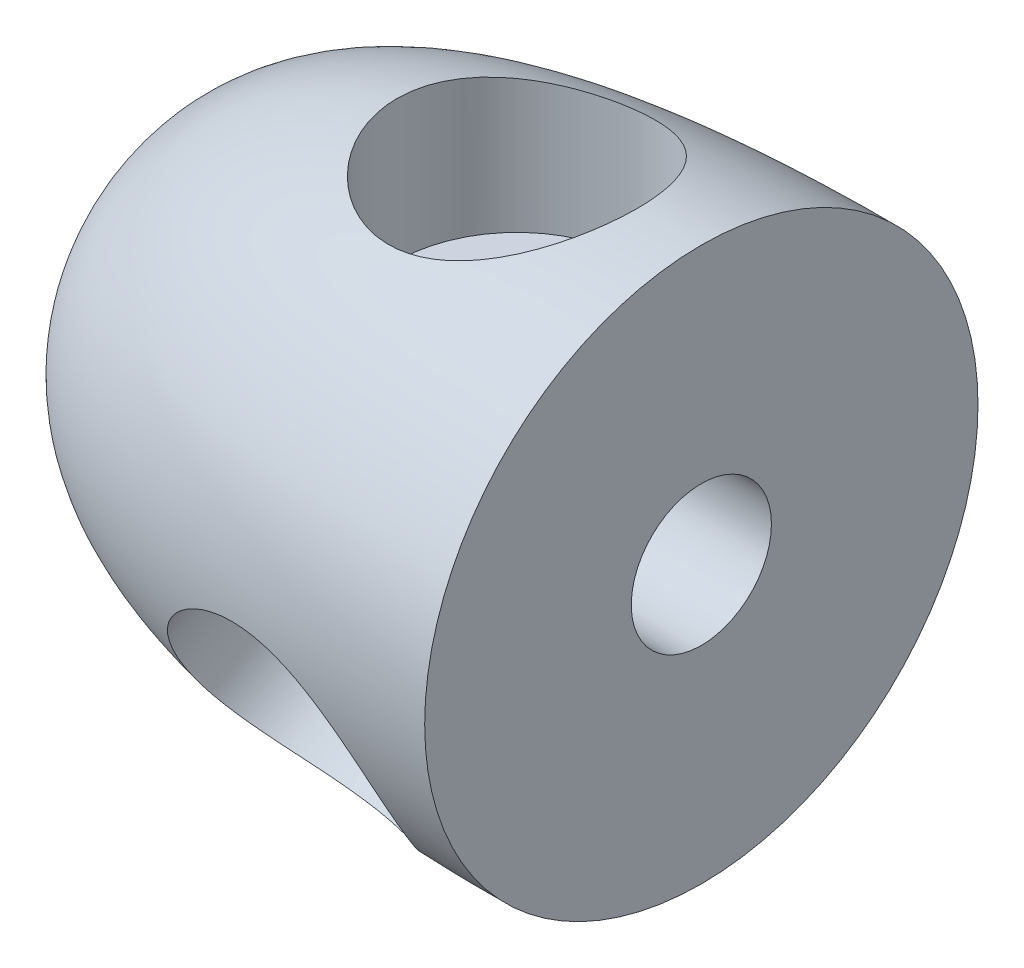
ISO-10303-21;
HEADER;
FILE_DESCRIPTION(('STEP AP214'),'2;1');
FILE_NAME('part.step','',(''),(''),'','','');
FILE_SCHEMA(('AUTOMOTIVE_DESIGN { 1 0 10303 214 1 1 1 1 }'));
ENDSEC;
DATA;
#1=APPLICATION_CONTEXT('core data for automotive mechanical design processes');
#2=APPLICATION_PROTOCOL_DEFINITION('international standard','automotive_design',2000,#1);
#3=PRODUCT_CONTEXT('',#1,'mechanical');
#4=PRODUCT('Part','Part','',(#3));
#5=PRODUCT_RELATED_PRODUCT_CATEGORY('part','',(#4));
#6=PRODUCT_DEFINITION_FORMATION('','',#4);
#7=PRODUCT_DEFINITION_CONTEXT('part definition',#1,'design');
#8=PRODUCT_DEFINITION('design','',#6,#7);
#9=PRODUCT_DEFINITION_SHAPE('','',#8);
#10=(LENGTH_UNIT() NAMED_UNIT(*) SI_UNIT(.MILLI.,.METRE.));
#11=(NAMED_UNIT(*) PLANE_ANGLE_UNIT() SI_UNIT($,.RADIAN.));
#12=(NAMED_UNIT(*) SI_UNIT($,.STERADIAN.) SOLID_ANGLE_UNIT());
#13=UNCERTAINTY_MEASURE_WITH_UNIT(LENGTH_MEASURE(1.E-05),#10,'distance_accuracy_value','');
#14=(GEOMETRIC_REPRESENTATION_CONTEXT(3) GLOBAL_UNCERTAINTY_ASSIGNED_CONTEXT((#13)) GLOBAL_UNIT_ASSIGNED_CONTEXT((#10,
#11,#12)) REPRESENTATION_CONTEXT('',''));
#15=CARTESIAN_POINT('',(0.,0.,0.));
#16=DIRECTION('',(0.,0.,1.));
#17=DIRECTION('',(1.,0.,0.));
#18=AXIS2_PLACEMENT_3D('',#15,#16,#17);
#19=CARTESIAN_POINT('',(0.,0.,0.));
#20=DIRECTION('',(-1.,0.,0.));
#21=DIRECTION('',(0.,0.,1.));
#22=AXIS2_PLACEMENT_3D('',#19,#20,#21);
#23=PLANE('',#22);
#24=CARTESIAN_POINT('',(0.,0.,0.));
#25=DIRECTION('',(1.,0.,0.));
#26=DIRECTION('',(0.,0.,-1.));
#27=AXIS2_PLACEMENT_3D('',#24,#25,#26);
#28=CIRCLE('',#27,4.826);
#29=CARTESIAN_POINT('',(0.,0.,-4.826));
#30=VERTEX_POINT('',#29);
#31=EDGE_CURVE('E60',#30,#30,#28,.T.);
#32=ORIENTED_EDGE('',*,*,#31,.F.);
#33=EDGE_LOOP('',(#32));
#34=FACE_BOUND('',#33,.T.);
#35=CARTESIAN_POINT('',(0.,0.,0.));
#36=DIRECTION('',(-1.,0.,0.));
#37=DIRECTION('',(0.,0.,1.));
#38=AXIS2_PLACEMENT_3D('',#35,#36,#37);
#39=CIRCLE('',#38,19.05);
#40=CARTESIAN_POINT('',(0.,0.,19.05));
#41=VERTEX_POINT('',#40);
#42=EDGE_CURVE('E11',#41,#41,#39,.T.);
#43=ORIENTED_EDGE('',*,*,#42,.F.);
#44=EDGE_LOOP('',(#43));
#45=FACE_BOUND('',#44,.T.);
#46=ADVANCED_FACE('F33',(#34,#45),#23,.F.);
#47=CARTESIAN_POINT('',(0.,19.05,0.));
#48=CARTESIAN_POINT('',(-25.4441957214029,19.05,0.));
#49=CARTESIAN_POINT('',(-38.1,14.1990316571237,0.));
#50=CARTESIAN_POINT('',(-38.1,0.,0.));
#51=B_SPLINE_CURVE_WITH_KNOTS('',3,(#47,#48,#49,#50),.UNSPECIFIED.,.F.,.F.,(4,4),(0.,1.),.UNSPECIFIED.);
#52=CARTESIAN_POINT('',(-38.1,0.,0.));
#53=DIRECTION('',(-1.,0.,0.));
#54=AXIS1_PLACEMENT('',#52,#53);
#55=SURFACE_OF_REVOLUTION('',#51,#54);
#56=CARTESIAN_POINT('',(-12.7,-1.14782703609506,-18.4980947448177));
#57=CARTESIAN_POINT('',(-12.9184952872142,-1.13648898272611,-18.4784599625496));
#58=CARTESIAN_POINT('',(-13.1373260376817,-1.13438877234002,-18.4574578105463));
#59=CARTESIAN_POINT('',(-13.5740864940327,-1.14879291758203,-18.4127967094672));
#60=CARTESIAN_POINT('',(-13.7920163205555,-1.16529469558681,-18.3891381288941));
#61=CARTESIAN_POINT('',(-14.2253045854663,-1.2167632959589,-18.3391447495213));
#62=CARTESIAN_POINT('',(-14.4406637530974,-1.25172474795742,-18.3128107308703));
#63=CARTESIAN_POINT('',(-14.8672966698883,-1.33970911927939,-18.2573268266777));
#64=CARTESIAN_POINT('',(-15.0785702602157,-1.39273273930844,-18.2281768319242));
#65=CARTESIAN_POINT('',(-15.4952440277729,-1.51611964245539,-18.1668726200219));
#66=CARTESIAN_POINT('',(-15.7006512322329,-1.58646111721522,-18.1347222126675));
#67=CARTESIAN_POINT('',(-16.1044609920185,-1.74367454707584,-18.0670808439223));
#68=CARTESIAN_POINT('',(-16.3028635923958,-1.83054639583457,-18.0315899040224));
#69=CARTESIAN_POINT('',(-16.6914018793307,-2.01983712317306,-17.9568991653748));
#70=CARTESIAN_POINT('',(-16.881536620275,-2.12225777411842,-17.9176989440085));
#71=CARTESIAN_POINT('',(-17.2524140665755,-2.34157526012525,-17.8351789583641));
#72=CARTESIAN_POINT('',(-17.4331533315445,-2.45847734564972,-17.7918577012712));
#73=CARTESIAN_POINT('',(-17.7887696530738,-2.70883932726889,-17.6994830743713));
#74=CARTESIAN_POINT('',(-17.9633635967759,-2.84265647396016,-17.650308039215));
#75=CARTESIAN_POINT('',(-18.3004148882535,-3.12296526081468,-17.5467570043083));
#76=CARTESIAN_POINT('',(-18.462871858884,-3.2694572945332,-17.4923808430573));
#77=CARTESIAN_POINT('',(-18.7747269887289,-3.57381086873153,-17.3780096484907));
#78=CARTESIAN_POINT('',(-18.9241211735587,-3.73167584299441,-17.3180129165242));
#79=CARTESIAN_POINT('',(-19.2088481047253,-4.05730697036979,-17.1920916547786));
#80=CARTESIAN_POINT('',(-19.3441852810386,-4.22506997788634,-17.1261690048069));
#81=CARTESIAN_POINT('',(-19.605432120648,-4.57643882767141,-16.9851877577304));
#82=CARTESIAN_POINT('',(-19.7306999673487,-4.76041471404987,-16.9098605157383));
#83=CARTESIAN_POINT('',(-19.9642156569031,-5.13604803893372,-16.7522706384485));
#84=CARTESIAN_POINT('',(-20.0724629971505,-5.32770570406825,-16.6700077984563));
#85=CARTESIAN_POINT('',(-20.2711162752368,-5.71704029151394,-16.4985061194298));
#86=CARTESIAN_POINT('',(-20.3615233280152,-5.91471683677977,-16.4092677168244));
#87=CARTESIAN_POINT('',(-20.5237825863659,-6.31441783695025,-16.2239222958931));
#88=CARTESIAN_POINT('',(-20.5956352159103,-6.51644219239229,-16.127815434577));
#89=CARTESIAN_POINT('',(-20.7194274905695,-6.92066874267272,-15.9302219032014));
#90=CARTESIAN_POINT('',(-20.7715984529644,-7.12283895857853,-15.8288147775326));
#91=CARTESIAN_POINT('',(-20.8568002834004,-7.5281222767446,-15.6200131567239));
#92=CARTESIAN_POINT('',(-20.8898312424468,-7.73123537451709,-15.5126186900547));
#93=CARTESIAN_POINT('',(-20.9364569808445,-8.13674806856399,-15.2924715863117));
#94=CARTESIAN_POINT('',(-20.9500547574998,-8.33914777006531,-15.1797197783073));
#95=CARTESIAN_POINT('',(-20.9577006911394,-8.74168750603885,-14.949617970229));
#96=CARTESIAN_POINT('',(-20.9517492252,-8.94182758402121,-14.832268058889));
#97=CARTESIAN_POINT('',(-20.9207890475571,-9.33283812464561,-14.597208815607));
#98=CARTESIAN_POINT('',(-20.8963144933303,-9.52381162868479,-14.4796000853769));
#99=CARTESIAN_POINT('',(-20.8291480270427,-9.90092904838058,-14.2418787475666));
#100=CARTESIAN_POINT('',(-20.7864564921679,-10.087073063948,-14.1217661918775));
#101=CARTESIAN_POINT('',(-20.6832063858706,-10.453374165127,-13.8801000130434));
#102=CARTESIAN_POINT('',(-20.6226474919351,-10.6335311426048,-13.758546363924));
#103=CARTESIAN_POINT('',(-20.4841418428173,-10.9868242030264,-13.5151452195354));
#104=CARTESIAN_POINT('',(-20.4061948385932,-11.1599601853698,-13.3932977200822));
#105=CARTESIAN_POINT('',(-20.2329434632021,-11.4994039883955,-13.1497366022226));
#106=CARTESIAN_POINT('',(-20.13753028628,-11.6656605127082,-13.02802892627));
#107=CARTESIAN_POINT('',(-19.9303390330262,-11.9894304254625,-12.7867841830526));
#108=CARTESIAN_POINT('',(-19.8185548874994,-12.1469405413584,-12.667247939355));
#109=CARTESIAN_POINT('',(-19.5794360253882,-12.4524693328677,-12.4317417870806));
#110=CARTESIAN_POINT('',(-19.4521043656259,-12.6004898655436,-12.3157711830526));
#111=CARTESIAN_POINT('',(-19.1826384311485,-12.8865992543691,-12.0886775040555));
#112=CARTESIAN_POINT('',(-19.0404973079141,-13.024683465196,-11.9775567058456));
#113=CARTESIAN_POINT('',(-18.7378109606518,-13.2944401141759,-11.7583189149993));
#114=CARTESIAN_POINT('',(-18.5768377733476,-13.4257902655102,-11.6503957713023));
#115=CARTESIAN_POINT('',(-18.2412782085447,-13.6769315325572,-11.4428029592319));
#116=CARTESIAN_POINT('',(-18.0666979288258,-13.7967277727119,-11.3431296346698));
#117=CARTESIAN_POINT('',(-17.7048948398284,-14.0245420399379,-11.153466843185));
#118=CARTESIAN_POINT('',(-17.5176661341102,-14.1325545114414,-11.0634819442206));
#119=CARTESIAN_POINT('',(-17.1319484048549,-14.3363977685932,-10.8947927385252));
#120=CARTESIAN_POINT('',(-16.9334641864974,-14.4322336968362,-10.8160836678008));
#121=CARTESIAN_POINT('',(-16.5271970511528,-14.6112177450672,-10.6715826199461));
#122=CARTESIAN_POINT('',(-16.3194473039732,-14.694407057472,-10.6057484968259));
#123=CARTESIAN_POINT('',(-15.8955260708653,-14.848249940804,-10.4879806130469));
#124=CARTESIAN_POINT('',(-15.6793545856511,-14.9189035127942,-10.4360468512092));
#125=CARTESIAN_POINT('',(-15.2403315961487,-15.0474483188076,-10.347225029226));
#126=CARTESIAN_POINT('',(-15.0174830602722,-15.1053451311995,-10.3103303866415));
#127=CARTESIAN_POINT('',(-14.5668051784789,-15.2082543377738,-10.2524272350052));
#128=CARTESIAN_POINT('',(-14.338976086487,-15.253267387171,-10.2314179180021));
#129=CARTESIAN_POINT('',(-13.8920877452246,-15.3283081112992,-10.2064964679175));
#130=CARTESIAN_POINT('',(-13.6731838851634,-15.3589900947633,-10.2017567396734));
#131=CARTESIAN_POINT('',(-13.234242507578,-15.4086202724904,-10.2072295057497));
#132=CARTESIAN_POINT('',(-13.0142050323935,-15.4275689018279,-10.2174414456127));
#133=CARTESIAN_POINT('',(-12.5746304602575,-15.4537269499764,-10.2526918769532));
#134=CARTESIAN_POINT('',(-12.3550933548262,-15.4609365692297,-10.2777301152634));
#135=CARTESIAN_POINT('',(-11.9180789025158,-15.4636507788908,-10.3422235220679));
#136=CARTESIAN_POINT('',(-11.7006015781104,-15.4591552417338,-10.3816788476781));
#137=CARTESIAN_POINT('',(-11.271911601463,-15.438652408868,-10.4737600418557));
#138=CARTESIAN_POINT('',(-11.0606544616317,-15.4227920874025,-10.5262122200383));
#139=CARTESIAN_POINT('',(-10.6428562885086,-15.3798001561127,-10.6437044231349));
#140=CARTESIAN_POINT('',(-10.4363151839877,-15.3526687166421,-10.7087442577887));
#141=CARTESIAN_POINT('',(-10.0290682648474,-15.2872075098412,-10.8504665904032));
#142=CARTESIAN_POINT('',(-9.82836279418354,-15.2488770839014,-10.9271497729787));
#143=CARTESIAN_POINT('',(-9.43379568453904,-15.1610923848323,-11.091110123667));
#144=CARTESIAN_POINT('',(-9.23993674325085,-15.1116337822899,-11.1783914088676));
#145=CARTESIAN_POINT('',(-8.64443829272204,-14.939217849054,-11.4669245486166));
#146=CARTESIAN_POINT('',(-8.25642084951648,-14.7965064030971,-11.6851968233755));
#147=CARTESIAN_POINT('',(-7.5239419748877,-14.4609085834534,-12.1541356577243));
#148=CARTESIAN_POINT('',(-7.17950015507321,-14.2679997365151,-12.4048167012819));
#149=CARTESIAN_POINT('',(-6.69148441750534,-13.9349114311254,-12.8045638418106));
#150=CARTESIAN_POINT('',(-6.5294211766749,-13.8123859836209,-12.9461976168481));
#151=CARTESIAN_POINT('',(-6.2208579601185,-13.5535564596037,-13.2337061284819));
#152=CARTESIAN_POINT('',(-6.07435198025333,-13.4172577386487,-13.379579201084));
#153=CARTESIAN_POINT('',(-5.79802192576486,-13.1311346456533,-13.6738803293112));
#154=CARTESIAN_POINT('',(-5.66819955938441,-12.9813088912434,-13.8223086448072));
#155=CARTESIAN_POINT('',(-5.42641393344239,-12.668590518352,-14.1199587579608));
#156=CARTESIAN_POINT('',(-5.31444966830199,-12.5056986363929,-14.2691805104513));
#157=CARTESIAN_POINT('',(-5.11289408669784,-12.1730843642453,-14.5617427610002));
#158=CARTESIAN_POINT('',(-5.02268792521406,-12.0037629741098,-14.7051152420678));
#159=CARTESIAN_POINT('',(-4.86101126885988,-11.6543661620466,-14.9893232505063));
#160=CARTESIAN_POINT('',(-4.78954054211976,-11.4742908732429,-15.1301588092541));
#161=CARTESIAN_POINT('',(-4.6662188040736,-11.1046012774512,-15.4076144064914));
#162=CARTESIAN_POINT('',(-4.61435620683492,-10.9149926787293,-15.5442368904047));
#163=CARTESIAN_POINT('',(-4.53085889689247,-10.5275131998224,-15.8118246339328));
#164=CARTESIAN_POINT('',(-4.49922248654266,-10.3296430145431,-15.9427903674754));
#165=CARTESIAN_POINT('',(-4.45842829473794,-9.94454716813221,-16.1867206810533));
#166=CARTESIAN_POINT('',(-4.44757350001607,-9.75786655626075,-16.3002653107287));
#167=CARTESIAN_POINT('',(-4.44323876722095,-9.38033501793383,-16.5205334484605));
#168=CARTESIAN_POINT('',(-4.44975771149075,-9.1894843605218,-16.6272573948408));
#169=CARTESIAN_POINT('',(-4.48009138341989,-8.80511510866059,-16.8330998359326));
#170=CARTESIAN_POINT('',(-4.50390371530709,-8.61159688741012,-16.9322193820311));
#171=CARTESIAN_POINT('',(-4.56854995206828,-8.2233949996745,-17.122280913585));
#172=CARTESIAN_POINT('',(-4.60938389761768,-8.02871133040546,-17.2132228794984));
#173=CARTESIAN_POINT('',(-4.70610294782906,-7.64574715092556,-17.3838444815077));
#174=CARTESIAN_POINT('',(-4.76148281788631,-7.45745504294409,-17.4637856648881));
#175=CARTESIAN_POINT('',(-4.88729301581174,-7.08252117424079,-17.6154508032594));
#176=CARTESIAN_POINT('',(-4.95772861284595,-6.8958800151905,-17.687171867859));
#177=CARTESIAN_POINT('',(-5.11299288443554,-6.52566908026919,-17.8223115146446));
#178=CARTESIAN_POINT('',(-5.19781828831536,-6.34209861684941,-17.8857319776938));
#179=CARTESIAN_POINT('',(-5.38121809009584,-5.97915475760558,-18.0044130775238));
#180=CARTESIAN_POINT('',(-5.47979780533144,-5.79978301645054,-18.0596705414469));
#181=CARTESIAN_POINT('',(-5.69576813606445,-5.43670831999566,-18.1650457088622));
#182=CARTESIAN_POINT('',(-5.81389688061132,-5.25331311508882,-18.2147111220819));
#183=CARTESIAN_POINT('',(-6.06382721305242,-4.89377332779291,-18.3055473858775));
#184=CARTESIAN_POINT('',(-6.19563483768487,-4.71763199497856,-18.346714461821));
#185=CARTESIAN_POINT('',(-6.47204291990589,-4.37386760361605,-18.4209831017293));
#186=CARTESIAN_POINT('',(-6.61664478915024,-4.20624548825807,-18.4540837741693));
#187=CARTESIAN_POINT('',(-6.91779277440168,-3.88068427812267,-18.5127263975279));
#188=CARTESIAN_POINT('',(-7.07433952084529,-3.72274569522521,-18.5382679491375));
#189=CARTESIAN_POINT('',(-7.4119713299299,-3.4050390828448,-18.5841652905332));
#190=CARTESIAN_POINT('',(-7.59401499505245,-3.24620079762704,-18.6039172018579));
#191=CARTESIAN_POINT('',(-7.97002152478262,-2.9426260479854,-18.6359221336318));
#192=CARTESIAN_POINT('',(-8.16398057134623,-2.79788510439158,-18.6481775425342));
#193=CARTESIAN_POINT('',(-8.56300276981987,-2.52368070547097,-18.6659401661332));
#194=CARTESIAN_POINT('',(-8.76807682388942,-2.39423266077158,-18.6714406254277));
#195=CARTESIAN_POINT('',(-9.18791649371384,-2.15220700302227,-18.6763889159406));
#196=CARTESIAN_POINT('',(-9.40267836217577,-2.03962293848769,-18.6758390677899));
#197=CARTESIAN_POINT('',(-9.86313478952387,-1.8220242413016,-18.6690462639198));
#198=CARTESIAN_POINT('',(-10.1097472450301,-1.71895976617485,-18.6622270990752));
#199=CARTESIAN_POINT('',(-10.6114458423594,-1.5366167307594,-18.6429111355069));
#200=CARTESIAN_POINT('',(-10.866532903279,-1.45734075982037,-18.6304137190843));
#201=CARTESIAN_POINT('',(-11.382733308436,-1.32418464387213,-18.6004736440842));
#202=CARTESIAN_POINT('',(-11.643840819596,-1.27028091820506,-18.583035601512));
#203=CARTESIAN_POINT('',(-12.1698012274377,-1.18898982600877,-18.5437681530434));
#204=CARTESIAN_POINT('',(-12.4346532372433,-1.16159628391624,-18.5219397713109));
#205=CARTESIAN_POINT('',(-12.7,-1.14782703609506,-18.4980947448177));
#206=B_SPLINE_CURVE_WITH_KNOTS('',3,(#56,#57,#58,#59,#60,#61,#62,#63,#64,#65,#66,#67,#68,#69,
#70,#71,#72,#73,#74,#75,#76,#77,#78,#79,#80,#81,#82,#83,#84,#85,#86,#87,#88,#89,#90,#91,#92,#93,
#94,#95,#96,#97,#98,#99,#100,#101,#102,#103,#104,#105,#106,#107,#108,#109,#110,#111,#112,#113,
#114,#115,#116,#117,#118,#119,#120,#121,#122,#123,#124,#125,#126,#127,#128,#129,#130,#131,#132,
#133,#134,#135,#136,#137,#138,#139,#140,#141,#142,#143,#144,#145,#146,#147,#148,#149,#150,#151,
#152,#153,#154,#155,#156,#157,#158,#159,#160,#161,#162,#163,#164,#165,#166,#167,#168,#169,#170,
#171,#172,#173,#174,#175,#176,#177,#178,#179,#180,#181,#182,#183,#184,#185,#186,#187,#188,#189,
#190,#191,#192,#193,#194,#195,#196,#197,#198,#199,#200,#201,#202,#203,#204,#205),.UNSPECIFIED.,
.T.,.F.,(4,2,2,2,2,2,2,2,2,2,2,2,2,2,2,2,2,2,2,2,2,2,2,2,2,2,2,2,2,2,2,2,2,2,2,2,2,2,2,2,2,2,2,
2,2,2,2,2,2,2,2,2,2,2,2,2,2,2,2,2,2,2,2,2,2,2,2,2,2,2,2,2,2,2,4),(0.,0.658767433132702,
1.31744359400188,1.97592823543046,2.63443842508975,3.29212355753751,3.94980445915374,
4.60756038439082,5.26555549082739,5.94102324720743,6.61651198439487,7.29220553070475,
7.96768548625868,8.6717665579586,9.37586841688855,10.0799262586036,10.7839680110356,
11.4794563698629,12.174941421812,12.8703191930705,13.5656835515832,14.2417251550496,
14.917752761624,15.5937925715136,16.2698420646335,16.9502559439277,17.6309227140283,
18.3114558719686,18.9923051457931,19.6938410636829,20.3950643884165,21.0966168956317,
21.7978721199457,22.4967918890696,23.1957115989271,23.8943250708334,24.5929030078313,
25.2553725934303,25.9178176130793,26.5802513214353,27.2426922491361,27.896717338074,
28.5507325423168,29.2047862167685,29.8590947919066,31.2552514632232,32.652034269049,
33.3942527174372,34.1361836663342,34.8781905214586,35.6201555798661,36.3377116566709,
37.0552588525831,37.7723814034753,38.4894437561629,39.1449298848142,39.8003738468973,
40.4557270231299,41.1110817654253,41.7461426056073,42.3814260677806,43.0165653286456,
43.6519508144424,44.3224210980896,44.9931885409671,45.6640300856292,46.3349070610408,
47.0612890777343,47.7874395418566,48.5143156152498,49.2409129007946,50.0417836110224,
50.842741463455,51.6429534383153,52.4429789584078),.UNSPECIFIED.);
#207=CARTESIAN_POINT('',(-12.7,-1.14782703609506,-18.4980947448177));
#208=VERTEX_POINT('',#207);
#209=EDGE_CURVE('E36',#208,#208,#206,.T.);
#210=ORIENTED_EDGE('',*,*,#209,.T.);
#211=EDGE_LOOP('',(#210));
#212=FACE_BOUND('',#211,.T.);
#213=CARTESIAN_POINT('',(-12.7,-15.445906452576,10.2430947448178));
#214=CARTESIAN_POINT('',(-12.9184952872142,-15.4345712590185,10.2234583114368));
#215=CARTESIAN_POINT('',(-13.1373260376817,-15.4174329670425,10.2111383998875));
#216=CARTESIAN_POINT('',(-13.5740864940327,-15.3715532463261,10.2012822050474));
#217=CARTESIAN_POINT('',(-13.7920163205555,-15.3428134255298,10.2037438737205));
#218=CARTESIAN_POINT('',(-14.2253045854663,-15.2737835887859,10.2233202994536));
#219=CARTESIAN_POINT('',(-14.4406637530974,-15.2334969336512,10.240430795712));
#220=CARTESIAN_POINT('',(-14.8672966698883,-15.1414542774582,10.2888855443165));
#221=CARTESIAN_POINT('',(-15.0785702602157,-15.0896978314671,10.3202303488856));
#222=CARTESIAN_POINT('',(-15.4952440277729,-14.9749133750272,10.396434435554));
#223=CARTESIAN_POINT('',(-15.7006512322329,-14.9118995681363,10.4412767359584));
#224=CARTESIAN_POINT('',(-16.1044609920185,-14.7747137095259,10.5436068756612));
#225=CARTESIAN_POINT('',(-16.3028635923958,-14.700541729589,10.60109463361));
#226=CARTESIAN_POINT('',(-16.6914018793307,-14.5412122888236,10.7276798428622));
#227=CARTESIAN_POINT('',(-16.881536620275,-14.4560535758137,10.7967786177699));
#228=CARTESIAN_POINT('',(-17.2524140665755,-14.2749304289223,10.9454531393237));
#229=CARTESIAN_POINT('',(-17.4331533315445,-14.1789620769938,11.0250326865969));
#230=CARTESIAN_POINT('',(-17.7887696530738,-13.9737823126237,11.1956652093709));
#231=CARTESIAN_POINT('',(-17.9633635967759,-13.8642869096008,11.2869667402894));
#232=CARTESIAN_POINT('',(-18.3004148882535,-13.6344546893561,11.477945753156));
#233=CARTESIAN_POINT('',(-18.462871858884,-13.5141175354932,11.5776234951828));
#234=CARTESIAN_POINT('',(-18.7747269887289,-13.2628923884382,11.7840158248879));
#235=CARTESIAN_POINT('',(-18.9241211735587,-13.1320012072797,11.890732536984));
#236=CARTESIAN_POINT('',(-19.2088481047253,-12.8601346320438,12.1097767346813));
#237=CARTESIAN_POINT('',(-19.3441852810386,-12.7191624387252,12.2221024360201));
#238=CARTESIAN_POINT('',(-19.605432120648,-12.4213846724072,12.4559061624942));
#239=CARTESIAN_POINT('',(-19.7306999673487,-12.2641614240558,12.5775703327856));
#240=CARTESIAN_POINT('',(-19.9642156569031,-11.9398679245016,12.8240833959981));
#241=CARTESIAN_POINT('',(-20.0724629971505,-11.7727973827137,12.9489323828386));
#242=CARTESIAN_POINT('',(-20.2711162752368,-11.4296052781622,13.2003551866252));
#243=CARTESIAN_POINT('',(-20.3615233280152,-11.2534842818799,13.3269288952551));
#244=CARTESIAN_POINT('',(-20.5237825863659,-10.893119938793,13.5804074048551));
#245=CARTESIAN_POINT('',(-20.5956352159103,-10.7088767776942,13.707312198193));
#246=CARTESIAN_POINT('',(-20.7194274905695,-10.3356424847593,13.9585858939323));
#247=CARTESIAN_POINT('',(-20.7715984529644,-10.1467362298525,14.0829668739609));
#248=CARTESIAN_POINT('',(-20.8568002834004,-9.76326706279766,14.3295517128184));
#249=CARTESIAN_POINT('',(-20.8898312424468,-9.56870417755004,14.4517555819961));
#250=CARTESIAN_POINT('',(-20.9364569808445,-9.17529484611557,14.6928663247263));
#251=CARTESIAN_POINT('',(-20.9500547574998,-8.97644906531049,14.8117737039426));
#252=CARTESIAN_POINT('',(-20.9577006911394,-8.57590518607119,15.0453324372892));
#253=CARTESIAN_POINT('',(-20.9517492252,-8.37420714272768,15.1599838734673));
#254=CARTESIAN_POINT('',(-20.9207890475571,-7.97513459633894,15.3810793131546));
#255=CARTESIAN_POINT('',(-20.8963144933303,-7.77779569623325,15.4876628539872));
#256=CARTESIAN_POINT('',(-20.8291480270427,-7.38336426881999,15.6953954507482));
#257=CARTESIAN_POINT('',(-20.7864564921679,-7.18627173649606,15.7965446191475));
#258=CARTESIAN_POINT('',(-20.6832063858706,-6.7938321358007,15.9929375887857));
#259=CARTESIAN_POINT('',(-20.6226474919351,-6.59848509900173,16.0881812833908));
#260=CARTESIAN_POINT('',(-20.4841418428173,-6.21104699444018,16.2724414765023));
#261=CARTESIAN_POINT('',(-20.4061948385932,-6.01895597335443,16.3614578857942));
#262=CARTESIAN_POINT('',(-20.2329434632021,-5.63830395640099,16.5336442834419));
#263=CARTESIAN_POINT('',(-20.13753028628,-5.44977375503418,16.6167728190653));
#264=CARTESIAN_POINT('',(-19.9303390330262,-5.0789647225013,16.7765434168829));
#265=CARTESIAN_POINT('',(-19.8185548874994,-4.89668824083825,16.853183056753));
#266=CARTESIAN_POINT('',(-19.5794360253882,-4.53996953446646,17.0000256756504));
#267=CARTESIAN_POINT('',(-19.4521043656259,-4.36552577894795,17.0702299152155));
#268=CARTESIAN_POINT('',(-19.1826384311485,-4.02580218948496,17.204461074701));
#269=CARTESIAN_POINT('',(-19.0404973079141,-3.86052664993288,17.2684851100337));
#270=CARTESIAN_POINT('',(-18.7378109606518,-3.53578282910042,17.3924823254669));
#271=CARTESIAN_POINT('',(-18.5768377733476,-3.37664356933537,17.4522733214648));
#272=CARTESIAN_POINT('',(-18.2412782085447,-3.07129228691586,17.5659716326309));
#273=CARTESIAN_POINT('',(-18.0666979288258,-2.92507453568814,17.6198815576017));
#274=CARTESIAN_POINT('',(-17.7048948398284,-2.64691460649663,17.7223431046216));
#275=CARTESIAN_POINT('',(-17.5176661341102,-2.51497916228473,17.770892199387));
#276=CARTESIAN_POINT('',(-17.1319484048549,-2.26696839623235,17.8630810356229));
#277=CARTESIAN_POINT('',(-16.9334641864974,-2.15088637735529,17.9067228487144));
#278=CARTESIAN_POINT('',(-16.5271970511528,-1.9362527749241,17.9894770574272));
#279=CARTESIAN_POINT('',(-16.3194473039732,-1.83764409566381,18.0286040537331));
#280=CARTESIAN_POINT('',(-15.8955260708653,-1.65873267489518,18.1029519570005));
#281=CARTESIAN_POINT('',(-15.6793545856511,-1.57842993183455,18.1381728642933));
#282=CARTESIAN_POINT('',(-15.2403315961487,-1.43723557457998,18.2050850208338));
#283=CARTESIAN_POINT('',(-15.0174830602722,-1.37633547064229,18.2367778098711));
#284=CARTESIAN_POINT('',(-14.5668051784789,-1.27473526707897,18.2969482212296));
#285=CARTESIAN_POINT('',(-14.338976086487,-1.23403414013958,18.3254260070078));
#286=CARTESIAN_POINT('',(-13.8920877452246,-1.17493116920305,18.3779524553789));
#287=CARTESIAN_POINT('',(-13.6731838851634,-1.15548545240452,18.4021539683753));
#288=CARTESIAN_POINT('',(-13.234242507578,-1.13540991799209,18.4478713461194));
#289=CARTESIAN_POINT('',(-13.0142050323935,-1.13477940266658,18.4693873104241));
#290=CARTESIAN_POINT('',(-12.5746304602575,-1.15222814762755,18.5096660603044));
#291=CARTESIAN_POINT('',(-12.3550933548262,-1.17030708844356,18.5284288928845));
#292=CARTESIAN_POINT('',(-11.9180789025158,-1.22480291228232,18.5630261708044));
#293=CARTESIAN_POINT('',(-11.7006015781104,-1.26121999515376,18.5788605842279));
#294=CARTESIAN_POINT('',(-11.271911601463,-1.35121606495531,18.6071452072053));
#295=CARTESIAN_POINT('',(-11.0606544616317,-1.40457114447803,18.6196358549954));
#296=CARTESIAN_POINT('',(-10.6428562885086,-1.52781834275114,18.6411498518889));
#297=CARTESIAN_POINT('',(-10.4363151839877,-1.59771021155461,18.650173253393));
#298=CARTESIAN_POINT('',(-10.0290682648474,-1.7531759552828,18.6643433516483));
#299=CARTESIAN_POINT('',(-9.82836279418354,-1.83875075240612,18.6694898203343));
#300=CARTESIAN_POINT('',(-9.43379568453904,-2.02463693085013,18.6754462162211));
#301=CARTESIAN_POINT('',(-9.23993674325085,-2.12495404237996,18.676254452584));
#302=CARTESIAN_POINT('',(-8.64443829272204,-2.4610390378543,18.6712044442591));
#303=CARTESIAN_POINT('',(-8.25642084951648,-2.72142409571578,18.656748844029));
#304=CARTESIAN_POINT('',(-7.5239419748877,-3.29533594890474,18.6005820239372));
#305=CARTESIAN_POINT('',(-7.17950015507321,-3.60888652434199,18.5588585836527));
#306=CARTESIAN_POINT('',(-6.69148441750534,-4.12162185582484,18.4702692197461));
#307=CARTESIAN_POINT('',(-6.52942117667489,-4.30554302679349,18.4349759571159));
#308=CARTESIAN_POINT('',(-6.22085796011849,-4.68394746368118,18.3545772698844));
#309=CARTESIAN_POINT('',(-6.07435198025333,-4.87842661076026,18.3094756513351));
#310=CARTESIAN_POINT('',(-5.79802192576486,-5.27636041066513,18.2088363483053));
#311=CARTESIAN_POINT('',(-5.66819955938441,-5.47981597973047,18.1532975965932));
#312=CARTESIAN_POINT('',(-5.42641393344239,-5.8939477256066,18.0313005980159));
#313=CARTESIAN_POINT('',(-5.31444966830199,-6.10462349504013,17.9648429664143));
#314=CARTESIAN_POINT('',(-5.11289408669784,-6.52429697227759,17.8230716823477));
#315=CARTESIAN_POINT('',(-5.02268792521406,-6.73312187815349,17.7481212976201));
#316=CARTESIAN_POINT('',(-4.86101126885988,-7.15395163945187,17.5876387865913));
#317=CARTESIAN_POINT('',(-4.78954054211976,-7.36595645548546,17.5021067912674));
#318=CARTESIAN_POINT('',(-4.6662188040736,-7.79108484901101,17.3206740084156));
#319=CARTESIAN_POINT('',(-4.61435620683492,-8.00420769016896,17.2247793871032));
#320=CARTESIAN_POINT('',(-4.53085889689247,-8.42968521325909,17.0230061866886));
#321=CARTESIAN_POINT('',(-4.49922248654266,-8.64203995817191,16.9171284463565));
#322=CARTESIAN_POINT('',(-4.45842829473794,-9.04583772968895,16.7055908172618));
#323=CARTESIAN_POINT('',(-4.44757350001607,-9.23751056938686,16.6006929798248));
#324=CARTESIAN_POINT('',(-4.44323876722095,-9.61703414147031,16.3838751457697));
#325=CARTESIAN_POINT('',(-4.44975771149075,-9.80488511893385,16.2719556013121));
#326=CARTESIAN_POINT('',(-4.48009138341989,-10.1753345280269,16.0420032853126));
#327=CARTESIAN_POINT('',(-4.50390371530709,-10.3579336835851,15.9239713626638));
#328=CARTESIAN_POINT('',(-4.56854995206828,-10.7166327420608,15.6828094318646));
#329=CARTESIAN_POINT('',(-4.60938389761768,-10.8927326294463,15.5596794115323));
#330=CARTESIAN_POINT('',(-4.70610294782906,-11.2319773609608,15.3133335043679));
#331=CARTESIAN_POINT('',(-4.76148281788631,-11.3953545105675,15.190238347214));
#332=CARTESIAN_POINT('',(-4.88729301581174,-11.7141673076172,14.9413686613635));
#333=CARTESIAN_POINT('',(-4.95772861284595,-11.869600151072,14.8155932085339));
#334=CARTESIAN_POINT('',(-5.11299288443554,-12.1717399857075,14.5625509575261));
#335=CARTESIAN_POINT('',(-5.19781828831535,-12.3184489495378,14.4352845043447));
#336=CARTESIAN_POINT('',(-5.38121809009584,-12.6027017265615,14.180306452007));
#337=CARTESIAN_POINT('',(-5.47979780533144,-12.7402419646452,14.0525946994072));
#338=CARTESIAN_POINT('',(-5.69576813606445,-13.0130368847823,13.7908503725136));
#339=CARTESIAN_POINT('',(-5.81389688061132,-13.1477459967734,13.6568581727419));
#340=CARTESIAN_POINT('',(-6.06382721305242,-13.4061824024532,13.3909057151702));
#341=CARTESIAN_POINT('',(-6.19563483768487,-13.529904802427,13.2589463842683));
#342=CARTESIAN_POINT('',(-6.47204291990589,-13.7661055269734,12.998372008386));
#343=CARTESIAN_POINT('',(-6.61664478915024,-13.8785826078677,12.8697573344699));
#344=CARTESIAN_POINT('',(-6.91779277440167,-14.0921492145086,12.6171343676851));
#345=CARTESIAN_POINT('',(-7.07433952084529,-14.1932381385033,12.493126318463));
#346=CARTESIAN_POINT('',(-7.41197132992991,-14.3918397083083,12.2409329918891));
#347=CARTESIAN_POINT('',(-7.59401499505245,-14.4883645078977,12.1132509574594));
#348=CARTESIAN_POINT('',(-7.97002152478262,-14.6678689666811,11.8663499782091));
#349=CARTESIAN_POINT('',(-8.16398057134623,-14.7508529339213,11.7471283485404));
#350=CARTESIAN_POINT('',(-8.56300276981987,-14.9033380166561,11.5185416850451));
#351=CARTESIAN_POINT('',(-8.76807682388942,-14.9728255764873,11.4091866195125));
#352=CARTESIAN_POINT('',(-9.18791649371384,-15.0981237506515,11.2020603967905));
#353=CARTESIAN_POINT('',(-9.40267836217577,-15.153939600452,11.1042848127668));
#354=CARTESIAN_POINT('',(-9.86313478952387,-15.2568562083307,10.9124424112382));
#355=CARTESIAN_POINT('',(-10.1097472450301,-15.302482875906,10.8197763751284));
#356=CARTESIAN_POINT('',(-10.6114458423594,-15.376926278465,10.6522046924713));
#357=CARTESIAN_POINT('',(-10.866532903279,-15.4057411838309,10.5773009795172));
#358=CARTESIAN_POINT('',(-11.382733308436,-15.4463903762637,10.4470143629367));
#359=CARTESIAN_POINT('',(-11.643840819596,-15.4582404512375,10.3916133458643));
#360=CARTESIAN_POINT('',(-12.1698012274377,-15.46487938942,10.3015794706866));
#361=CARTESIAN_POINT('',(-12.4346532372433,-15.4596722273624,10.2669417764686));
#362=CARTESIAN_POINT('',(-12.7,-15.445906452576,10.2430947448178));
#363=B_SPLINE_CURVE_WITH_KNOTS('',3,(#213,#214,#215,#216,#217,#218,#219,#220,#221,#222,#223,
#224,#225,#226,#227,#228,#229,#230,#231,#232,#233,#234,#235,#236,#237,#238,#239,#240,#241,#242,
#243,#244,#245,#246,#247,#248,#249,#250,#251,#252,#253,#254,#255,#256,#257,#258,#259,#260,#261,
#262,#263,#264,#265,#266,#267,#268,#269,#270,#271,#272,#273,#274,#275,#276,#277,#278,#279,#280,
#281,#282,#283,#284,#285,#286,#287,#288,#289,#290,#291,#292,#293,#294,#295,#296,#297,#298,#299,
#300,#301,#302,#303,#304,#305,#306,#307,#308,#309,#310,#311,#312,#313,#314,#315,#316,#317,#318,
#319,#320,#321,#322,#323,#324,#325,#326,#327,#328,#329,#330,#331,#332,#333,#334,#335,#336,#337,
#338,#339,#340,#341,#342,#343,#344,#345,#346,#347,#348,#349,#350,#351,#352,#353,#354,#355,#356,
#357,#358,#359,#360,#361,#362),.UNSPECIFIED.,.T.,.F.,(4,2,2,2,2,2,2,2,2,2,2,2,2,2,2,2,2,2,2,2,2,
2,2,2,2,2,2,2,2,2,2,2,2,2,2,2,2,2,2,2,2,2,2,2,2,2,2,2,2,2,2,2,2,2,2,2,2,2,2,2,2,2,2,2,2,2,2,2,2,
2,2,2,2,2,4),(0.,0.658767433132702,1.31744359400188,1.97592823543046,2.63443842508975,
3.29212355753751,3.94980445915374,4.60756038439083,5.26555549082739,5.94102324720743,
6.61651198439488,7.29220553070476,7.96768548625868,8.67176655795861,9.37586841688855,
10.0799262586036,10.7839680110356,11.4794563698629,12.174941421812,12.8703191930705,
13.5656835515832,14.2417251550496,14.917752761624,15.5937925715136,16.2698420646334,
16.9502559439277,17.6309227140283,18.3114558719686,18.9923051457931,19.6938410636829,
20.3950643884165,21.0966168956317,21.7978721199457,22.4967918890696,23.1957115989271,
23.8943250708334,24.5929030078313,25.2553725934303,25.9178176130793,26.5802513214353,
27.2426922491361,27.896717338074,28.5507325423168,29.2047862167684,29.8590947919066,
31.2552514632232,32.652034269049,33.3942527174372,34.1361836663342,34.8781905214586,
35.6201555798661,36.3377116566709,37.0552588525831,37.7723814034753,38.4894437561629,
39.1449298848142,39.8003738468973,40.4557270231299,41.1110817654253,41.7461426056073,
42.3814260677806,43.0165653286455,43.6519508144423,44.3224210980896,44.9931885409671,
45.6640300856292,46.3349070610408,47.0612890777343,47.7874395418565,48.5143156152498,
49.2409129007946,50.0417836110223,50.842741463455,51.6429534383152,52.4429789584077),.UNSPECIFIED.);
#364=CARTESIAN_POINT('',(-12.7,-15.445906452576,10.2430947448178));
#365=VERTEX_POINT('',#364);
#366=EDGE_CURVE('E71',#365,#365,#363,.T.);
#367=ORIENTED_EDGE('',*,*,#366,.T.);
#368=EDGE_LOOP('',(#367));
#369=FACE_BOUND('',#368,.T.);
#370=CARTESIAN_POINT('',(-4.445,18.9965597967635,0.));
#371=CARTESIAN_POINT('',(-4.44499916861544,18.9965604143696,0.218916044389746));
#372=CARTESIAN_POINT('',(-4.45371601802801,18.9925500079329,0.437820937191759));
#373=CARTESIAN_POINT('',(-4.48847841414161,18.976605257414,0.873947294001446));
#374=CARTESIAN_POINT('',(-4.51452277609399,18.9646714550849,1.09116887207662));
#375=CARTESIAN_POINT('',(-4.58364180399708,18.9331589163698,1.52230811117576));
#376=CARTESIAN_POINT('',(-4.62671594699344,18.9135804147392,1.73622587344446));
#377=CARTESIAN_POINT('',(-4.72942594036536,18.8672245351636,2.15924802091052));
#378=CARTESIAN_POINT('',(-4.78906218228624,18.8404469870261,2.36835229218536));
#379=CARTESIAN_POINT('',(-4.92409603231349,18.780368906236,2.77976339879453));
#380=CARTESIAN_POINT('',(-4.99944837172223,18.7470871253738,2.98208786115044));
#381=CARTESIAN_POINT('',(-5.16534211616953,18.6746410689075,3.37939711759588));
#382=CARTESIAN_POINT('',(-5.25588920570867,18.6354745923588,3.57437913125525));
#383=CARTESIAN_POINT('',(-5.45137858378946,18.5520620420814,3.95580813047498));
#384=CARTESIAN_POINT('',(-5.55631810031202,18.5078169467748,4.14225675038883));
#385=CARTESIAN_POINT('',(-5.77981643206143,18.4150939802703,4.50573655145571));
#386=CARTESIAN_POINT('',(-5.89838056997235,18.3666144566092,4.68276401229093));
#387=CARTESIAN_POINT('',(-6.28580445556073,18.211151491339,5.21555423500686));
#388=CARTESIAN_POINT('',(-6.57666840024998,18.0984122663214,5.55399266636751));
#389=CARTESIAN_POINT('',(-7.207808719629,17.8668923809446,6.17885559653486));
#390=CARTESIAN_POINT('',(-7.54810730570463,17.7481090205765,6.46525658360948));
#391=CARTESIAN_POINT('',(-8.10310023138497,17.5679715149968,6.86077841539147));
#392=CARTESIAN_POINT('',(-8.30298727583786,17.5054946065048,6.99057862921928));
#393=CARTESIAN_POINT('',(-8.71372269205749,17.3827965141468,7.23266109570464));
#394=CARTESIAN_POINT('',(-8.92456706529969,17.3225745210339,7.34494967964784));
#395=CARTESIAN_POINT('',(-9.3560984944195,17.2057201855018,7.55119670611335));
#396=CARTESIAN_POINT('',(-9.57678945934158,17.1490892907244,7.64514778774717));
#397=CARTESIAN_POINT('',(-10.0264880354057,17.0407785490437,7.81376899903056));
#398=CARTESIAN_POINT('',(-10.255491701787,16.9890963950207,7.88844814112141));
#399=CARTESIAN_POINT('',(-10.7168135428345,16.892616187538,8.01675958621423));
#400=CARTESIAN_POINT('',(-10.9490272738424,16.8477248418287,8.07069664991706));
#401=CARTESIAN_POINT('',(-11.4184666196997,16.7649094495359,8.15841320596966));
#402=CARTESIAN_POINT('',(-11.6556922163418,16.7269853776461,8.19219277153558));
#403=CARTESIAN_POINT('',(-12.133151847641,16.6589324315664,8.239005497999));
#404=CARTESIAN_POINT('',(-12.3733839956091,16.6287989027953,8.25205107083992));
#405=CARTESIAN_POINT('',(-12.8549596717831,16.5768352210398,8.25705653997845));
#406=CARTESIAN_POINT('',(-13.0963031107858,16.5550044129635,8.24901810021854));
#407=CARTESIAN_POINT('',(-13.5586494794309,16.5212666113966,8.21322860876187));
#408=CARTESIAN_POINT('',(-13.7797325600296,16.5087045550153,8.18710887029949));
#409=CARTESIAN_POINT('',(-14.2193379096913,16.4906941633614,8.11702964402221));
#410=CARTESIAN_POINT('',(-14.4378603240992,16.4852454223759,8.07307117383969));
#411=CARTESIAN_POINT('',(-14.8706852894821,16.4811340938607,7.96760746474892));
#412=CARTESIAN_POINT('',(-15.0849878880608,16.4824714297334,7.90610242390457));
#413=CARTESIAN_POINT('',(-15.5077981259253,16.49138800673,7.76600890204525));
#414=CARTESIAN_POINT('',(-15.7163057116923,16.4989673054805,7.68742026331691));
#415=CARTESIAN_POINT('',(-16.1213356724765,16.5194071028727,7.51576688138691));
#416=CARTESIAN_POINT('',(-16.3180233998391,16.5321421409001,7.42307660917422));
#417=CARTESIAN_POINT('',(-16.703277615861,16.5620886073412,7.22260093865747));
#418=CARTESIAN_POINT('',(-16.8918411623835,16.5793016418204,7.11481013085219));
#419=CARTESIAN_POINT('',(-17.2595892670044,16.6173190046527,6.88492434667422));
#420=CARTESIAN_POINT('',(-17.4387759507453,16.6381225144441,6.76283263267674));
#421=CARTESIAN_POINT('',(-17.7868603076977,16.6824111085192,6.50505989513326));
#422=CARTESIAN_POINT('',(-17.9557532254643,16.7058974179989,6.36937266621428));
#423=CARTESIAN_POINT('',(-18.2902284727231,16.7558033602357,6.0783136003751));
#424=CARTESIAN_POINT('',(-18.4552420348907,16.7823103680925,5.92230266986517));
#425=CARTESIAN_POINT('',(-18.771731116353,16.8361586592279,5.59736772844769));
#426=CARTESIAN_POINT('',(-18.9232120057242,16.8634996057508,5.42844888951077));
#427=CARTESIAN_POINT('',(-19.2118560784566,16.9180154053517,5.07860307120773));
#428=CARTESIAN_POINT('',(-19.3490111964143,16.9451901568434,4.89766942026911));
#429=CARTESIAN_POINT('',(-19.6079789430799,16.9983798090987,4.5250753159495));
#430=CARTESIAN_POINT('',(-19.7297971683302,17.0243951306948,4.33341881250473));
#431=CARTESIAN_POINT('',(-19.9607331932878,17.0751329121805,3.93464551216075));
#432=CARTESIAN_POINT('',(-20.0693631284294,17.0997935694053,3.72723795271169));
#433=CARTESIAN_POINT('',(-20.2687285946733,17.146080740566,3.30365926401567));
#434=CARTESIAN_POINT('',(-20.3594637095588,17.1677071839256,3.08748793107242));
#435=CARTESIAN_POINT('',(-20.5223019839977,17.2071735651334,2.64793106071459));
#436=CARTESIAN_POINT('',(-20.5944076460047,17.2250140114887,2.42454649677739));
#437=CARTESIAN_POINT('',(-20.7193930660215,17.2563002737951,1.97216214698512));
#438=CARTESIAN_POINT('',(-20.7722733678423,17.2697462140488,1.74316252015409));
#439=CARTESIAN_POINT('',(-20.8573938185475,17.2915430809463,1.28636382151657));
#440=CARTESIAN_POINT('',(-20.8900638890764,17.2999999422752,1.05864986905046));
#441=CARTESIAN_POINT('',(-20.9362907664404,17.3119997693758,0.601161183824284));
#442=CARTESIAN_POINT('',(-20.949847816689,17.3155427977276,0.371386477346415));
#443=CARTESIAN_POINT('',(-20.9577282681383,17.3175999086428,-0.0884875480986953));
#444=CARTESIAN_POINT('',(-20.9520539306484,17.3161145824617,-0.318586825721266));
#445=CARTESIAN_POINT('',(-20.9215269542849,17.3081643887366,-0.777420851070633));
#446=CARTESIAN_POINT('',(-20.8966745207747,17.3016995745142,-1.00615561338255));
#447=CARTESIAN_POINT('',(-20.8287686918354,17.2841960835138,-1.45555708685943));
#448=CARTESIAN_POINT('',(-20.7861286712654,17.273261393626,-1.67629049128851));
#449=CARTESIAN_POINT('',(-20.6830673860982,17.2471715304162,-2.11330553863672));
#450=CARTESIAN_POINT('',(-20.6226464343229,17.2320164313445,-2.32958725980317));
#451=CARTESIAN_POINT('',(-20.4845072738049,17.1979608361466,-2.756218712658));
#452=CARTESIAN_POINT('',(-20.4067910839908,17.1790607772096,-2.96656913349955));
#453=CARTESIAN_POINT('',(-20.2346086255372,17.1381012350095,-3.38007052094662));
#454=CARTESIAN_POINT('',(-20.1401359475722,17.1160405434331,-3.58321869690362));
#455=CARTESIAN_POINT('',(-19.9335139347339,17.069101541269,-3.98408674099643));
#456=CARTESIAN_POINT('',(-19.8211092648169,17.0441842732273,-4.18167042775859));
#457=CARTESIAN_POINT('',(-19.580456796441,16.9926488632434,-4.56682932047192));
#458=CARTESIAN_POINT('',(-19.4522018393831,16.9660299554145,-4.7543999489753));
#459=CARTESIAN_POINT('',(-19.1807307180866,16.9120269932318,-5.1182691900909));
#460=CARTESIAN_POINT('',(-19.0375143099634,16.8846429264107,-5.29456761888105));
#461=CARTESIAN_POINT('',(-18.7370266778037,16.8301064553676,-5.63478896520498));
#462=CARTESIAN_POINT('',(-18.5797553418298,16.8029540529926,-5.79871178415681));
#463=CARTESIAN_POINT('',(-18.2475345672115,16.7491863543302,-6.11754541177906));
#464=CARTESIAN_POINT('',(-18.0722134990781,16.7226073713571,-6.27207548484191));
#465=CARTESIAN_POINT('',(-17.7089475255914,16.6719840126255,-6.56582137517381));
#466=CARTESIAN_POINT('',(-17.5210075403423,16.6479386582953,-6.7050431059447));
#467=CARTESIAN_POINT('',(-17.1336685236981,16.6035410631569,-6.96723069725296));
#468=CARTESIAN_POINT('',(-16.9342685869484,16.5831891146632,-7.09019527090931));
#469=CARTESIAN_POINT('',(-16.525402441783,16.5473145903089,-7.31889224041315));
#470=CARTESIAN_POINT('',(-16.3159365457427,16.5317918646954,-7.4246251705612));
#471=CARTESIAN_POINT('',(-15.8924564164819,16.5068530746296,-7.61618280275153));
#472=CARTESIAN_POINT('',(-15.6786001514845,16.4973283928112,-7.70234238454485));
#473=CARTESIAN_POINT('',(-15.2442529775705,16.4847803238188,-7.85651982690879));
#474=CARTESIAN_POINT('',(-15.0237621470685,16.4817568598368,-7.92453790180187));
#475=CARTESIAN_POINT('',(-14.5779612192916,16.482866373018,-8.04185244670915));
#476=CARTESIAN_POINT('',(-14.352653055733,16.4869965300141,-8.09115628508274));
#477=CARTESIAN_POINT('',(-13.8989637939892,16.5028238889321,-8.1707126524909));
#478=CARTESIAN_POINT('',(-13.6705828227487,16.514520779189,-8.20096596609355));
#479=CARTESIAN_POINT('',(-13.224516519789,16.5448150977284,-8.2412029772815));
#480=CARTESIAN_POINT('',(-13.0068914729619,16.5630227444743,-8.25215746596606));
#481=CARTESIAN_POINT('',(-12.5721428118157,16.6062541248241,-8.25687178245032));
#482=CARTESIAN_POINT('',(-12.3550191785737,16.6312775968217,-8.25063227010954));
#483=CARTESIAN_POINT('',(-11.9227673295866,16.6878159480101,-8.22118417130522));
#484=CARTESIAN_POINT('',(-11.7076392788327,16.7193313590309,-8.19797419419677));
#485=CARTESIAN_POINT('',(-11.2808038529715,16.7883341411692,-8.13495247164311));
#486=CARTESIAN_POINT('',(-11.0690965662483,16.8258216663205,-8.0951402979485));
#487=CARTESIAN_POINT('',(-10.6485178808626,16.9064531480667,-7.99896236072774));
#488=CARTESIAN_POINT('',(-10.4396888823505,16.9496447725135,-7.94245148661701));
#489=CARTESIAN_POINT('',(-10.0279413633483,17.0406211220667,-7.8135577992279));
#490=CARTESIAN_POINT('',(-9.82502498268201,17.0884074837904,-7.74116931859272));
#491=CARTESIAN_POINT('',(-9.42624937207235,17.1876572358302,-7.58114359230566));
#492=CARTESIAN_POINT('',(-9.23038973108907,17.2391204114573,-7.4935072365487));
#493=CARTESIAN_POINT('',(-8.84660136950055,17.344790408047,-7.30357493083318));
#494=CARTESIAN_POINT('',(-8.65867553692775,17.3989982125729,-7.20127370118449));
#495=CARTESIAN_POINT('',(-8.27748442946657,17.5134244694423,-6.97419048294767));
#496=CARTESIAN_POINT('',(-8.08493192186782,17.5737833777682,-6.84828128376257));
#497=CARTESIAN_POINT('',(-7.7111529871967,17.6952786141465,-6.58097464970207));
#498=CARTESIAN_POINT('',(-7.52992701023995,17.7564149729786,-6.43957659991458));
#499=CARTESIAN_POINT('',(-7.17970119665925,17.878247614679,-6.14199925281738));
#500=CARTESIAN_POINT('',(-7.0107080530865,17.9389436405265,-5.98581197001263));
#501=CARTESIAN_POINT('',(-6.68610764809984,18.0585966171271,-5.65959816762696));
#502=CARTESIAN_POINT('',(-6.53049572434073,18.1175541688639,-5.48957650879672));
#503=CARTESIAN_POINT('',(-6.22721316398132,18.2349997203199,-5.12892965059399));
#504=CARTESIAN_POINT('',(-6.08017056951568,18.2933588180113,-4.93773319495991));
#505=CARTESIAN_POINT('',(-5.8028884291936,18.4054981922338,-4.54237260508617));
#506=CARTESIAN_POINT('',(-5.67264190268715,18.4592803678081,-4.33821391110219));
#507=CARTESIAN_POINT('',(-5.43005472133948,18.5609930086556,-3.91813008462562));
#508=CARTESIAN_POINT('',(-5.3177134574685,18.6089236729492,-3.70220535267852));
#509=CARTESIAN_POINT('',(-5.11208737800516,18.6977188032854,-3.26006704759815));
#510=CARTESIAN_POINT('',(-5.0188014683336,18.7385836749957,-3.03385406608571));
#511=CARTESIAN_POINT('',(-4.85519613536668,18.810906188223,-2.58071800175916));
#512=CARTESIAN_POINT('',(-4.78420172581662,18.8426372189577,-2.3540824705699));
#513=CARTESIAN_POINT('',(-4.66183022568689,18.8976699996483,-1.89456478565759));
#514=CARTESIAN_POINT('',(-4.61045282026643,18.9209718848864,-1.66168273225156));
#515=CARTESIAN_POINT('',(-4.52799677548578,18.9585061798577,-1.19175001884362));
#516=CARTESIAN_POINT('',(-4.49690775411734,18.9727432281746,-0.954701554762923));
#517=CARTESIAN_POINT('',(-4.45541059996674,18.991769343149,-0.478430845374085));
#518=CARTESIAN_POINT('',(-4.44500090845088,18.9965591219077,-0.239208765270911));
#519=CARTESIAN_POINT('',(-4.445,18.9965597967635,0.));
#520=B_SPLINE_CURVE_WITH_KNOTS('',3,(#370,#371,#372,#373,#374,#375,#376,#377,#378,#379,#380,
#381,#382,#383,#384,#385,#386,#387,#388,#389,#390,#391,#392,#393,#394,#395,#396,#397,#398,#399,
#400,#401,#402,#403,#404,#405,#406,#407,#408,#409,#410,#411,#412,#413,#414,#415,#416,#417,#418,
#419,#420,#421,#422,#423,#424,#425,#426,#427,#428,#429,#430,#431,#432,#433,#434,#435,#436,#437,
#438,#439,#440,#441,#442,#443,#444,#445,#446,#447,#448,#449,#450,#451,#452,#453,#454,#455,#456,
#457,#458,#459,#460,#461,#462,#463,#464,#465,#466,#467,#468,#469,#470,#471,#472,#473,#474,#475,
#476,#477,#478,#479,#480,#481,#482,#483,#484,#485,#486,#487,#488,#489,#490,#491,#492,#493,#494,
#495,#496,#497,#498,#499,#500,#501,#502,#503,#504,#505,#506,#507,#508,#509,#510,#511,#512,#513,
#514,#515,#516,#517,#518,#519),.UNSPECIFIED.,.T.,.F.,(4,2,2,2,2,2,2,2,2,2,2,2,2,2,2,2,2,2,2,2,2,
2,2,2,2,2,2,2,2,2,2,2,2,2,2,2,2,2,2,2,2,2,2,2,2,2,2,2,2,2,2,2,2,2,2,2,2,2,2,2,2,2,2,2,2,2,2,2,2,
2,2,2,2,2,4),(0.,0.656519935780386,1.31299498738121,1.96944988136359,2.62592029594689,
3.28052529825549,3.93537574272105,4.59010023793727,5.24508138730303,6.6197014694272,
7.99494110084918,8.73335340493727,9.47149811587973,10.2099385201295,10.9480329674812,
11.6748256900699,12.4016157727826,13.1279706146896,13.8542681346659,14.522362997571,
15.1904197535404,15.858468968852,16.5265243517618,17.1792164107824,17.8321428860096,
18.4849207022793,19.1379978336911,19.8231098135557,20.5079487062372,21.1931711079339,
21.8781427378319,22.5835681123865,23.289009892544,23.9943568629244,24.6996838802143,
25.3894385249721,26.0791843852943,26.7688491451397,27.4585065199955,28.132958367392,
28.8073983497953,29.4817596439169,30.1563794384304,30.8416411474733,31.5272134859025,
32.2127970014935,32.8983859777477,33.6031670669802,34.307674940764,35.0122385485042,
35.716780305724,36.4081661342305,37.0995437943924,37.7906489552451,38.4817256520785,
39.1369238222709,39.7920968480702,40.4473235680473,41.1025671904748,41.7636812416508,
42.4250316561752,43.086343485974,43.7478940039221,44.4606547027354,45.1734437086285,
45.8866198061555,46.5995464001933,47.3430900512268,48.0863236736296,48.8295320102803,
49.5726976629971,50.2905078104998,51.0083064371096,51.7257374618945,52.4431144072507),.UNSPECIFIED.);
#521=CARTESIAN_POINT('',(-4.445,18.9965597967635,0.));
#522=VERTEX_POINT('',#521);
#523=EDGE_CURVE('E43',#522,#522,#520,.T.);
#524=ORIENTED_EDGE('',*,*,#523,.T.);
#525=EDGE_LOOP('',(#524));
#526=FACE_BOUND('',#525,.T.);
#527=CARTESIAN_POINT('',(-38.1,0.,0.));
#528=VERTEX_POINT('',#527);
#529=VERTEX_LOOP('',#528);
#530=FACE_BOUND('',#529,.T.);
#531=ORIENTED_EDGE('',*,*,#42,.T.);
#532=EDGE_LOOP('',(#531));
#533=FACE_BOUND('',#532,.T.);
#534=ADVANCED_FACE('F47',(#212,#369,#526,#530,#533),#55,.T.);
#535=CARTESIAN_POINT('',(-12.7,7.62,0.));
#536=DIRECTION('',(0.,1.,0.));
#537=DIRECTION('',(0.,0.,1.));
#538=AXIS2_PLACEMENT_3D('',#535,#536,#537);
#539=CYLINDRICAL_SURFACE('',#538,8.255);
#540=CARTESIAN_POINT('',(-12.7,7.62,0.));
#541=DIRECTION('',(0.,1.,0.));
#542=DIRECTION('',(0.,0.,1.));
#543=AXIS2_PLACEMENT_3D('',#540,#541,#542);
#544=CIRCLE('',#543,8.255);
#545=CARTESIAN_POINT('',(-12.7,7.62,8.255));
#546=VERTEX_POINT('',#545);
#547=EDGE_CURVE('E74',#546,#546,#544,.T.);
#548=ORIENTED_EDGE('',*,*,#547,.F.);
#549=EDGE_LOOP('',(#548));
#550=FACE_BOUND('',#549,.T.);
#551=ORIENTED_EDGE('',*,*,#523,.F.);
#552=EDGE_LOOP('',(#551));
#553=FACE_BOUND('',#552,.T.);
#554=ADVANCED_FACE('F50',(#550,#553),#539,.F.);
#555=CARTESIAN_POINT('',(0.,7.62,0.));
#556=DIRECTION('',(0.,1.,0.));
#557=DIRECTION('',(0.,0.,1.));
#558=AXIS2_PLACEMENT_3D('',#555,#556,#557);
#559=PLANE('',#558);
#560=ORIENTED_EDGE('',*,*,#547,.T.);
#561=EDGE_LOOP('',(#560));
#562=FACE_BOUND('',#561,.T.);
#563=ADVANCED_FACE('F101',(#562),#559,.T.);
#564=CARTESIAN_POINT('',(-12.7,-3.80999999999994,6.59911357683746));
#565=DIRECTION('',(0.,-0.499999999999992,0.866025403784443));
#566=DIRECTION('',(0.,-0.866025403784443,-0.499999999999992));
#567=AXIS2_PLACEMENT_3D('',#564,#565,#566);
#568=CYLINDRICAL_SURFACE('',#567,8.255);
#569=CARTESIAN_POINT('',(-12.7,-3.80999999999994,6.59911357683746));
#570=DIRECTION('',(0.,-0.499999999999992,0.866025403784443));
#571=DIRECTION('',(0.,-0.866025403784443,-0.499999999999992));
#572=AXIS2_PLACEMENT_3D('',#569,#570,#571);
#573=CIRCLE('',#572,8.255);
#574=CARTESIAN_POINT('',(-12.7,-10.9590397082405,2.47161357683752));
#575=VERTEX_POINT('',#574);
#576=EDGE_CURVE('E65',#575,#575,#573,.T.);
#577=ORIENTED_EDGE('',*,*,#576,.F.);
#578=EDGE_LOOP('',(#577));
#579=FACE_BOUND('',#578,.T.);
#580=ORIENTED_EDGE('',*,*,#366,.F.);
#581=EDGE_LOOP('',(#580));
#582=FACE_BOUND('',#581,.T.);
#583=ADVANCED_FACE('F96',(#579,#582),#568,.F.);
#584=CARTESIAN_POINT('',(0.,-3.80999999999994,6.59911357683746));
#585=DIRECTION('',(0.,-0.499999999999992,0.866025403784443));
#586=DIRECTION('',(0.,-0.866025403784443,-0.499999999999992));
#587=AXIS2_PLACEMENT_3D('',#584,#585,#586);
#588=PLANE('',#587);
#589=ORIENTED_EDGE('',*,*,#576,.T.);
#590=EDGE_LOOP('',(#589));
#591=FACE_BOUND('',#590,.T.);
#592=ADVANCED_FACE('F100',(#591),#588,.T.);
#593=CARTESIAN_POINT('',(-12.7,-3.81000000000003,-6.59911357683741));
#594=DIRECTION('',(0.,-0.500000000000004,-0.866025403784436));
#595=DIRECTION('',(0.,0.866025403784436,-0.500000000000004));
#596=AXIS2_PLACEMENT_3D('',#593,#594,#595);
#597=CYLINDRICAL_SURFACE('',#596,8.255);
#598=CARTESIAN_POINT('',(-12.7,-3.81000000000003,-6.59911357683741));
#599=DIRECTION('',(0.,-0.500000000000004,-0.866025403784436));
#600=DIRECTION('',(0.,0.866025403784436,-0.500000000000004));
#601=AXIS2_PLACEMENT_3D('',#598,#599,#600);
#602=CIRCLE('',#601,8.255);
#603=CARTESIAN_POINT('',(-12.7,3.33903970824049,-10.7266135768374));
#604=VERTEX_POINT('',#603);
#605=EDGE_CURVE('E68',#604,#604,#602,.T.);
#606=ORIENTED_EDGE('',*,*,#605,.F.);
#607=EDGE_LOOP('',(#606));
#608=FACE_BOUND('',#607,.T.);
#609=ORIENTED_EDGE('',*,*,#209,.F.);
#610=EDGE_LOOP('',(#609));
#611=FACE_BOUND('',#610,.T.);
#612=ADVANCED_FACE('F138',(#608,#611),#597,.F.);
#613=CARTESIAN_POINT('',(0.,-3.81000000000003,-6.59911357683741));
#614=DIRECTION('',(0.,-0.500000000000004,-0.866025403784436));
#615=DIRECTION('',(0.,0.866025403784436,-0.500000000000004));
#616=AXIS2_PLACEMENT_3D('',#613,#614,#615);
#617=PLANE('',#616);
#618=ORIENTED_EDGE('',*,*,#605,.T.);
#619=EDGE_LOOP('',(#618));
#620=FACE_BOUND('',#619,.T.);
#621=ADVANCED_FACE('F147',(#620),#617,.T.);
#622=CARTESIAN_POINT('',(-12.7,0.,0.));
#623=DIRECTION('',(1.,0.,0.));
#624=DIRECTION('',(0.,0.,-1.));
#625=AXIS2_PLACEMENT_3D('',#622,#623,#624);
#626=CYLINDRICAL_SURFACE('',#625,4.826);
#627=CARTESIAN_POINT('',(-12.7,0.,0.));
#628=DIRECTION('',(1.,0.,0.));
#629=DIRECTION('',(0.,0.,-1.));
#630=AXIS2_PLACEMENT_3D('',#627,#628,#629);
#631=CIRCLE('',#630,4.826);
#632=CARTESIAN_POINT('',(-12.7,0.,-4.826));
#633=VERTEX_POINT('',#632);
#634=EDGE_CURVE('E62',#633,#633,#631,.T.);
#635=ORIENTED_EDGE('',*,*,#634,.F.);
#636=EDGE_LOOP('',(#635));
#637=FACE_BOUND('',#636,.T.);
#638=ORIENTED_EDGE('',*,*,#31,.T.);
#639=EDGE_LOOP('',(#638));
#640=FACE_BOUND('',#639,.T.);
#641=ADVANCED_FACE('F155',(#637,#640),#626,.F.);
#642=CARTESIAN_POINT('',(-12.7,0.,0.));
#643=DIRECTION('',(1.,0.,0.));
#644=DIRECTION('',(0.,0.,-1.));
#645=AXIS2_PLACEMENT_3D('',#642,#643,#644);
#646=PLANE('',#645);
#647=ORIENTED_EDGE('',*,*,#634,.T.);
#648=EDGE_LOOP('',(#647));
#649=FACE_BOUND('',#648,.T.);
#650=ADVANCED_FACE('F169',(#649),#646,.T.);
#651=CLOSED_SHELL('',(#46,#534,#554,#563,#583,#592,#612,#621,#641,#650));
#652=MANIFOLD_SOLID_BREP('B2',#651);
#653=ADVANCED_BREP_SHAPE_REPRESENTATION('',(#18,#652),#14);
#654=SHAPE_DEFINITION_REPRESENTATION(#9,#653);
ENDSEC;
END-ISO-10303-21;
